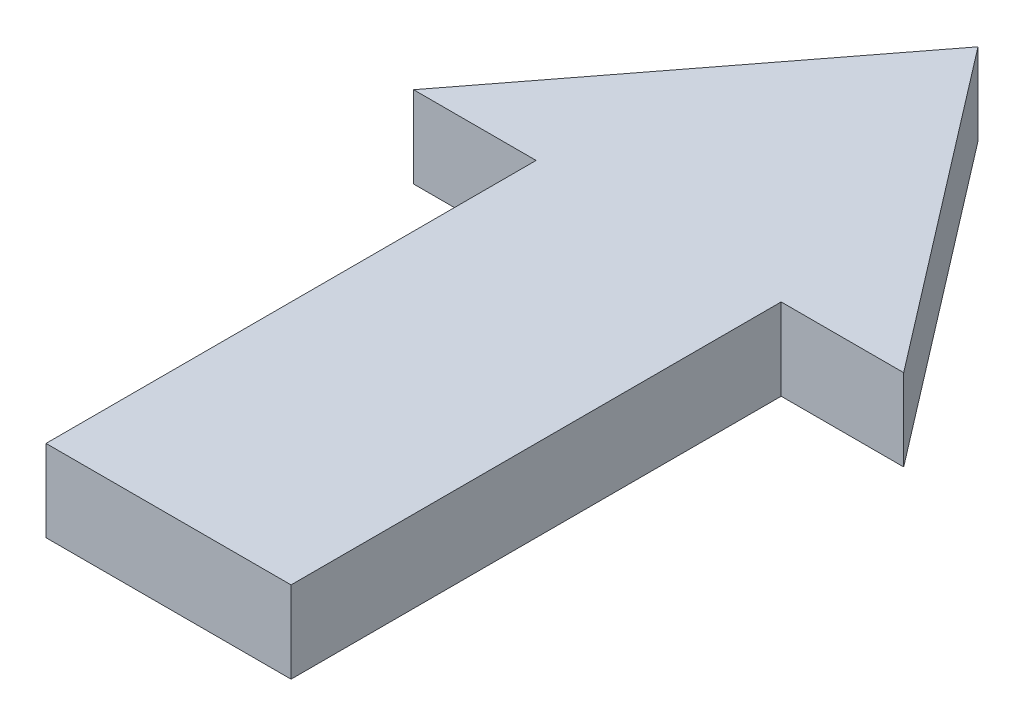
ISO-10303-21;
HEADER;
FILE_DESCRIPTION(('STEP AP214'),'2;1');
FILE_NAME('part.step','',(''),(''),'','','');
FILE_SCHEMA(('AUTOMOTIVE_DESIGN { 1 0 10303 214 1 1 1 1 }'));
ENDSEC;
DATA;
#1=APPLICATION_CONTEXT('core data for automotive mechanical design processes');
#2=APPLICATION_PROTOCOL_DEFINITION('international standard','automotive_design',2000,#1);
#3=PRODUCT_CONTEXT('',#1,'mechanical');
#4=PRODUCT('Part','Part','',(#3));
#5=PRODUCT_RELATED_PRODUCT_CATEGORY('part','',(#4));
#6=PRODUCT_DEFINITION_FORMATION('','',#4);
#7=PRODUCT_DEFINITION_CONTEXT('part definition',#1,'design');
#8=PRODUCT_DEFINITION('design','',#6,#7);
#9=PRODUCT_DEFINITION_SHAPE('','',#8);
#10=(LENGTH_UNIT() NAMED_UNIT(*) SI_UNIT(.MILLI.,.METRE.));
#11=(NAMED_UNIT(*) PLANE_ANGLE_UNIT() SI_UNIT($,.RADIAN.));
#12=(NAMED_UNIT(*) SI_UNIT($,.STERADIAN.) SOLID_ANGLE_UNIT());
#13=UNCERTAINTY_MEASURE_WITH_UNIT(LENGTH_MEASURE(1.E-05),#10,'distance_accuracy_value','');
#14=(GEOMETRIC_REPRESENTATION_CONTEXT(3) GLOBAL_UNCERTAINTY_ASSIGNED_CONTEXT((#13)) GLOBAL_UNIT_ASSIGNED_CONTEXT((#10,
#11,#12)) REPRESENTATION_CONTEXT('',''));
#15=CARTESIAN_POINT('',(0.,0.,0.));
#16=DIRECTION('',(0.,0.,1.));
#17=DIRECTION('',(1.,0.,0.));
#18=AXIS2_PLACEMENT_3D('',#15,#16,#17);
#19=CARTESIAN_POINT('',(0.,25.4,-76.2));
#20=DIRECTION('',(0.,0.,-1.));
#21=DIRECTION('',(-1.,0.,0.));
#22=AXIS2_PLACEMENT_3D('',#19,#20,#21);
#23=PLANE('',#22);
#24=DIRECTION('',(1.,0.,0.));
#25=VECTOR('',#24,1.);
#26=CARTESIAN_POINT('',(0.,0.,-76.2));
#27=LINE('',#26,#25);
#28=CARTESIAN_POINT('',(-76.2,0.,-76.2));
#29=VERTEX_POINT('',#28);
#30=CARTESIAN_POINT('',(-38.1,0.,-76.2));
#31=VERTEX_POINT('',#30);
#32=EDGE_CURVE('E143',#29,#31,#27,.T.);
#33=ORIENTED_EDGE('',*,*,#32,.T.);
#34=DIRECTION('',(0.,-1.,0.));
#35=VECTOR('',#34,1.);
#36=CARTESIAN_POINT('',(-38.1,25.4,-76.2));
#37=LINE('',#36,#35);
#38=CARTESIAN_POINT('',(-38.1,25.4,-76.2));
#39=VERTEX_POINT('',#38);
#40=EDGE_CURVE('E11',#39,#31,#37,.T.);
#41=ORIENTED_EDGE('',*,*,#40,.F.);
#42=DIRECTION('',(1.,0.,0.));
#43=VECTOR('',#42,1.);
#44=CARTESIAN_POINT('',(0.,25.4,-76.2));
#45=LINE('',#44,#43);
#46=CARTESIAN_POINT('',(-76.2,25.4,-76.2));
#47=VERTEX_POINT('',#46);
#48=EDGE_CURVE('E123',#47,#39,#45,.T.);
#49=ORIENTED_EDGE('',*,*,#48,.F.);
#50=DIRECTION('',(0.,-1.,0.));
#51=VECTOR('',#50,1.);
#52=CARTESIAN_POINT('',(-76.2,25.4,-76.2));
#53=LINE('',#52,#51);
#54=EDGE_CURVE('E63',#47,#29,#53,.T.);
#55=ORIENTED_EDGE('',*,*,#54,.T.);
#56=EDGE_LOOP('',(#33,#41,#49,#55));
#57=FACE_BOUND('',#56,.T.);
#58=ADVANCED_FACE('F45',(#57),#23,.F.);
#59=CARTESIAN_POINT('',(-38.1,25.4,0.));
#60=DIRECTION('',(1.,0.,0.));
#61=DIRECTION('',(0.,0.,-1.));
#62=AXIS2_PLACEMENT_3D('',#59,#60,#61);
#63=PLANE('',#62);
#64=DIRECTION('',(0.,0.,1.));
#65=VECTOR('',#64,1.);
#66=CARTESIAN_POINT('',(-38.1,0.,0.));
#67=LINE('',#66,#65);
#68=CARTESIAN_POINT('',(-38.1,0.,76.2));
#69=VERTEX_POINT('',#68);
#70=EDGE_CURVE('E146',#31,#69,#67,.T.);
#71=ORIENTED_EDGE('',*,*,#70,.T.);
#72=DIRECTION('',(0.,-1.,0.));
#73=VECTOR('',#72,1.);
#74=CARTESIAN_POINT('',(-38.1,25.4,76.2));
#75=LINE('',#74,#73);
#76=CARTESIAN_POINT('',(-38.1,25.4,76.2));
#77=VERTEX_POINT('',#76);
#78=EDGE_CURVE('E55',#77,#69,#75,.T.);
#79=ORIENTED_EDGE('',*,*,#78,.F.);
#80=DIRECTION('',(0.,0.,1.));
#81=VECTOR('',#80,1.);
#82=CARTESIAN_POINT('',(-38.1,25.4,0.));
#83=LINE('',#82,#81);
#84=EDGE_CURVE('E99',#39,#77,#83,.T.);
#85=ORIENTED_EDGE('',*,*,#84,.F.);
#86=ORIENTED_EDGE('',*,*,#40,.T.);
#87=EDGE_LOOP('',(#71,#79,#85,#86));
#88=FACE_BOUND('',#87,.T.);
#89=ADVANCED_FACE('F47',(#88),#63,.F.);
#90=CARTESIAN_POINT('',(0.,25.4,76.2));
#91=DIRECTION('',(0.,0.,-1.));
#92=DIRECTION('',(-1.,0.,0.));
#93=AXIS2_PLACEMENT_3D('',#90,#91,#92);
#94=PLANE('',#93);
#95=DIRECTION('',(1.,0.,0.));
#96=VECTOR('',#95,1.);
#97=CARTESIAN_POINT('',(0.,0.,76.2));
#98=LINE('',#97,#96);
#99=CARTESIAN_POINT('',(38.1,0.,76.2));
#100=VERTEX_POINT('',#99);
#101=EDGE_CURVE('E149',#69,#100,#98,.T.);
#102=ORIENTED_EDGE('',*,*,#101,.T.);
#103=DIRECTION('',(0.,-1.,0.));
#104=VECTOR('',#103,1.);
#105=CARTESIAN_POINT('',(38.1,25.4,76.2));
#106=LINE('',#105,#104);
#107=CARTESIAN_POINT('',(38.1,25.4,76.2));
#108=VERTEX_POINT('',#107);
#109=EDGE_CURVE('E170',#108,#100,#106,.T.);
#110=ORIENTED_EDGE('',*,*,#109,.F.);
#111=DIRECTION('',(1.,0.,0.));
#112=VECTOR('',#111,1.);
#113=CARTESIAN_POINT('',(0.,25.4,76.2));
#114=LINE('',#113,#112);
#115=EDGE_CURVE('E179',#77,#108,#114,.T.);
#116=ORIENTED_EDGE('',*,*,#115,.F.);
#117=ORIENTED_EDGE('',*,*,#78,.T.);
#118=EDGE_LOOP('',(#102,#110,#116,#117));
#119=FACE_BOUND('',#118,.T.);
#120=ADVANCED_FACE('F177',(#119),#94,.F.);
#121=CARTESIAN_POINT('',(38.1,25.4,0.));
#122=DIRECTION('',(1.,0.,0.));
#123=DIRECTION('',(0.,0.,-1.));
#124=AXIS2_PLACEMENT_3D('',#121,#122,#123);
#125=PLANE('',#124);
#126=DIRECTION('',(0.,0.,1.));
#127=VECTOR('',#126,1.);
#128=CARTESIAN_POINT('',(38.1,0.,0.));
#129=LINE('',#128,#127);
#130=CARTESIAN_POINT('',(38.1,0.,-76.2));
#131=VERTEX_POINT('',#130);
#132=EDGE_CURVE('E153',#131,#100,#129,.T.);
#133=ORIENTED_EDGE('',*,*,#132,.F.);
#134=DIRECTION('',(0.,-1.,0.));
#135=VECTOR('',#134,1.);
#136=CARTESIAN_POINT('',(38.1,25.4,-76.2));
#137=LINE('',#136,#135);
#138=CARTESIAN_POINT('',(38.1,25.4,-76.2));
#139=VERTEX_POINT('',#138);
#140=EDGE_CURVE('E132',#139,#131,#137,.T.);
#141=ORIENTED_EDGE('',*,*,#140,.F.);
#142=DIRECTION('',(0.,0.,1.));
#143=VECTOR('',#142,1.);
#144=CARTESIAN_POINT('',(38.1,25.4,0.));
#145=LINE('',#144,#143);
#146=EDGE_CURVE('E119',#139,#108,#145,.T.);
#147=ORIENTED_EDGE('',*,*,#146,.T.);
#148=ORIENTED_EDGE('',*,*,#109,.T.);
#149=EDGE_LOOP('',(#133,#141,#147,#148));
#150=FACE_BOUND('',#149,.T.);
#151=ADVANCED_FACE('F184',(#150),#125,.T.);
#152=CARTESIAN_POINT('',(76.2,0.,-76.2));
#153=VERTEX_POINT('',#152);
#154=EDGE_CURVE('E128',#131,#153,#27,.T.);
#155=ORIENTED_EDGE('',*,*,#154,.T.);
#156=DIRECTION('',(0.,-1.,0.));
#157=VECTOR('',#156,1.);
#158=CARTESIAN_POINT('',(76.2,25.4,-76.2));
#159=LINE('',#158,#157);
#160=CARTESIAN_POINT('',(76.2,25.4,-76.2));
#161=VERTEX_POINT('',#160);
#162=EDGE_CURVE('E125',#161,#153,#159,.T.);
#163=ORIENTED_EDGE('',*,*,#162,.F.);
#164=EDGE_CURVE('E112',#139,#161,#45,.T.);
#165=ORIENTED_EDGE('',*,*,#164,.F.);
#166=ORIENTED_EDGE('',*,*,#140,.T.);
#167=EDGE_LOOP('',(#155,#163,#165,#166));
#168=FACE_BOUND('',#167,.T.);
#169=ADVANCED_FACE('F126',(#168),#23,.F.);
#170=CARTESIAN_POINT('',(84.7627796000197,25.4,-65.0407683632073));
#171=DIRECTION('',(-0.793353340291236,0.,0.608761429008719));
#172=DIRECTION('',(0.608761429008719,0.,0.793353340291236));
#173=AXIS2_PLACEMENT_3D('',#170,#171,#172);
#174=PLANE('',#173);
#175=DIRECTION('',(-0.608761429008719,0.,-0.793353340291236));
#176=VECTOR('',#175,1.);
#177=CARTESIAN_POINT('',(84.7627796000197,0.,-65.0407683632073));
#178=LINE('',#177,#176);
#179=CARTESIAN_POINT('',(0.,0.,-175.5057734105));
#180=VERTEX_POINT('',#179);
#181=EDGE_CURVE('E157',#153,#180,#178,.T.);
#182=ORIENTED_EDGE('',*,*,#181,.T.);
#183=DIRECTION('',(0.,-1.,0.));
#184=VECTOR('',#183,1.);
#185=CARTESIAN_POINT('',(0.,25.4,-175.5057734105));
#186=LINE('',#185,#184);
#187=CARTESIAN_POINT('',(0.,25.4,-175.5057734105));
#188=VERTEX_POINT('',#187);
#189=EDGE_CURVE('E87',#188,#180,#186,.T.);
#190=ORIENTED_EDGE('',*,*,#189,.F.);
#191=DIRECTION('',(-0.608761429008719,0.,-0.793353340291236));
#192=VECTOR('',#191,1.);
#193=CARTESIAN_POINT('',(84.7627796000197,25.4,-65.0407683632073));
#194=LINE('',#193,#192);
#195=EDGE_CURVE('E117',#161,#188,#194,.T.);
#196=ORIENTED_EDGE('',*,*,#195,.F.);
#197=ORIENTED_EDGE('',*,*,#162,.T.);
#198=EDGE_LOOP('',(#182,#190,#196,#197));
#199=FACE_BOUND('',#198,.T.);
#200=ADVANCED_FACE('F134',(#199),#174,.F.);
#201=CARTESIAN_POINT('',(-84.7627796000197,25.4,-65.0407683632073));
#202=DIRECTION('',(-0.793353340291236,0.,-0.608761429008719));
#203=DIRECTION('',(-0.608761429008719,0.,0.793353340291236));
#204=AXIS2_PLACEMENT_3D('',#201,#202,#203);
#205=PLANE('',#204);
#206=DIRECTION('',(0.608761429008719,0.,-0.793353340291236));
#207=VECTOR('',#206,1.);
#208=CARTESIAN_POINT('',(-84.7627796000197,0.,-65.0407683632073));
#209=LINE('',#208,#207);
#210=EDGE_CURVE('E160',#29,#180,#209,.T.);
#211=ORIENTED_EDGE('',*,*,#210,.F.);
#212=ORIENTED_EDGE('',*,*,#54,.F.);
#213=DIRECTION('',(0.608761429008719,0.,-0.793353340291236));
#214=VECTOR('',#213,1.);
#215=CARTESIAN_POINT('',(-84.7627796000197,25.4,-65.0407683632073));
#216=LINE('',#215,#214);
#217=EDGE_CURVE('E136',#47,#188,#216,.T.);
#218=ORIENTED_EDGE('',*,*,#217,.T.);
#219=ORIENTED_EDGE('',*,*,#189,.T.);
#220=EDGE_LOOP('',(#211,#212,#218,#219));
#221=FACE_BOUND('',#220,.T.);
#222=ADVANCED_FACE('F206',(#221),#205,.T.);
#223=CARTESIAN_POINT('',(0.,25.4,0.));
#224=DIRECTION('',(0.,1.,0.));
#225=DIRECTION('',(0.,0.,1.));
#226=AXIS2_PLACEMENT_3D('',#223,#224,#225);
#227=PLANE('',#226);
#228=ORIENTED_EDGE('',*,*,#48,.T.);
#229=ORIENTED_EDGE('',*,*,#84,.T.);
#230=ORIENTED_EDGE('',*,*,#115,.T.);
#231=ORIENTED_EDGE('',*,*,#146,.F.);
#232=ORIENTED_EDGE('',*,*,#164,.T.);
#233=ORIENTED_EDGE('',*,*,#195,.T.);
#234=ORIENTED_EDGE('',*,*,#217,.F.);
#235=EDGE_LOOP('',(#228,#229,#230,#231,#232,#233,#234));
#236=FACE_BOUND('',#235,.T.);
#237=ADVANCED_FACE('F114',(#236),#227,.T.);
#238=CARTESIAN_POINT('',(0.,0.,0.));
#239=DIRECTION('',(0.,1.,0.));
#240=DIRECTION('',(0.,0.,1.));
#241=AXIS2_PLACEMENT_3D('',#238,#239,#240);
#242=PLANE('',#241);
#243=ORIENTED_EDGE('',*,*,#32,.F.);
#244=ORIENTED_EDGE('',*,*,#210,.T.);
#245=ORIENTED_EDGE('',*,*,#181,.F.);
#246=ORIENTED_EDGE('',*,*,#154,.F.);
#247=ORIENTED_EDGE('',*,*,#132,.T.);
#248=ORIENTED_EDGE('',*,*,#101,.F.);
#249=ORIENTED_EDGE('',*,*,#70,.F.);
#250=EDGE_LOOP('',(#243,#244,#245,#246,#247,#248,#249));
#251=FACE_BOUND('',#250,.T.);
#252=ADVANCED_FACE('F181',(#251),#242,.F.);
#253=CLOSED_SHELL('',(#58,#89,#120,#151,#169,#200,#222,#237,#252));
#254=MANIFOLD_SOLID_BREP('B2',#253);
#255=ADVANCED_BREP_SHAPE_REPRESENTATION('',(#18,#254),#14);
#256=SHAPE_DEFINITION_REPRESENTATION(#9,#255);
ENDSEC;
END-ISO-10303-21;
